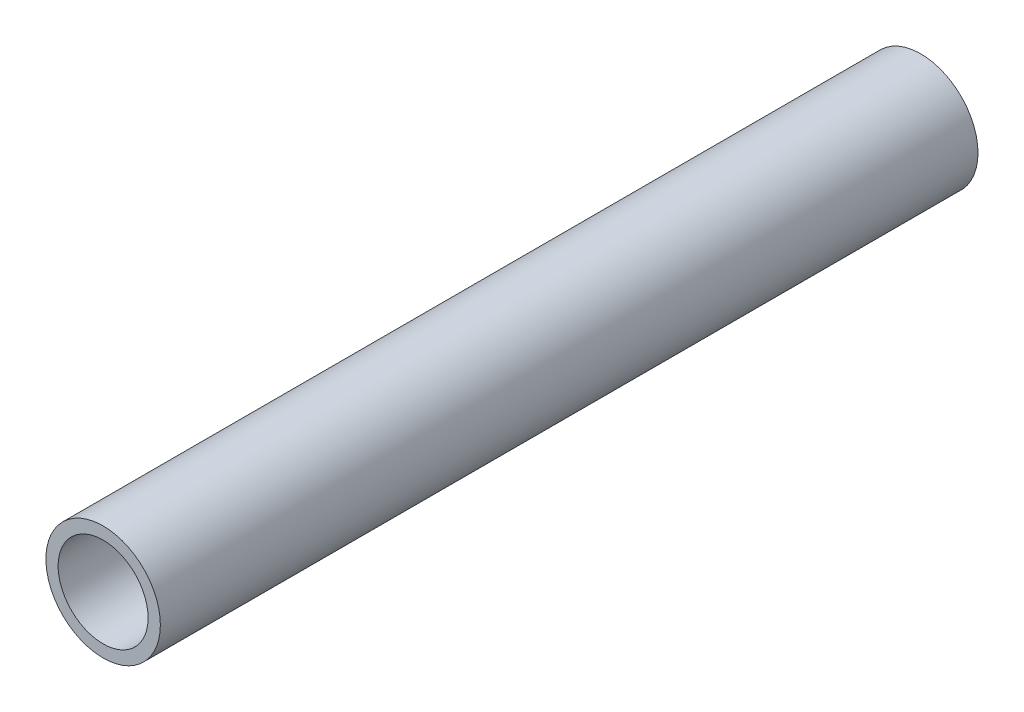
ISO-10303-21;
HEADER;
FILE_DESCRIPTION(('STEP AP214'),'2;1');
FILE_NAME('part.step','',(''),(''),'','','');
FILE_SCHEMA(('AUTOMOTIVE_DESIGN { 1 0 10303 214 1 1 1 1 }'));
ENDSEC;
DATA;
#1=APPLICATION_CONTEXT('core data for automotive mechanical design processes');
#2=APPLICATION_PROTOCOL_DEFINITION('international standard','automotive_design',2000,#1);
#3=PRODUCT_CONTEXT('',#1,'mechanical');
#4=PRODUCT('Part','Part','',(#3));
#5=PRODUCT_RELATED_PRODUCT_CATEGORY('part','',(#4));
#6=PRODUCT_DEFINITION_FORMATION('','',#4);
#7=PRODUCT_DEFINITION_CONTEXT('part definition',#1,'design');
#8=PRODUCT_DEFINITION('design','',#6,#7);
#9=PRODUCT_DEFINITION_SHAPE('','',#8);
#10=(LENGTH_UNIT() NAMED_UNIT(*) SI_UNIT(.MILLI.,.METRE.));
#11=(NAMED_UNIT(*) PLANE_ANGLE_UNIT() SI_UNIT($,.RADIAN.));
#12=(NAMED_UNIT(*) SI_UNIT($,.STERADIAN.) SOLID_ANGLE_UNIT());
#13=UNCERTAINTY_MEASURE_WITH_UNIT(LENGTH_MEASURE(1.E-05),#10,'distance_accuracy_value','');
#14=(GEOMETRIC_REPRESENTATION_CONTEXT(3) GLOBAL_UNCERTAINTY_ASSIGNED_CONTEXT((#13)) GLOBAL_UNIT_ASSIGNED_CONTEXT((#10,
#11,#12)) REPRESENTATION_CONTEXT('',''));
#15=CARTESIAN_POINT('',(0.,0.,0.));
#16=DIRECTION('',(0.,0.,1.));
#17=DIRECTION('',(1.,0.,0.));
#18=AXIS2_PLACEMENT_3D('',#15,#16,#17);
#19=CARTESIAN_POINT('',(0.,0.,50.));
#20=DIRECTION('',(0.,0.,1.));
#21=DIRECTION('',(1.,0.,0.));
#22=AXIS2_PLACEMENT_3D('',#19,#20,#21);
#23=PLANE('',#22);
#24=CARTESIAN_POINT('',(0.,0.,50.));
#25=DIRECTION('',(0.,0.,1.));
#26=DIRECTION('',(1.,0.,0.));
#27=AXIS2_PLACEMENT_3D('',#24,#25,#26);
#28=CIRCLE('',#27,3.5);
#29=CARTESIAN_POINT('',(3.5,0.,50.));
#30=VERTEX_POINT('',#29);
#31=EDGE_CURVE('E10',#30,#30,#28,.T.);
#32=ORIENTED_EDGE('',*,*,#31,.T.);
#33=EDGE_LOOP('',(#32));
#34=FACE_BOUND('',#33,.T.);
#35=CARTESIAN_POINT('',(0.,0.,50.));
#36=DIRECTION('',(0.,0.,1.));
#37=DIRECTION('',(1.,0.,0.));
#38=AXIS2_PLACEMENT_3D('',#35,#36,#37);
#39=CIRCLE('',#38,2.75);
#40=CARTESIAN_POINT('',(2.75,0.,50.));
#41=VERTEX_POINT('',#40);
#42=EDGE_CURVE('E42',#41,#41,#39,.T.);
#43=ORIENTED_EDGE('',*,*,#42,.F.);
#44=EDGE_LOOP('',(#43));
#45=FACE_BOUND('',#44,.T.);
#46=ADVANCED_FACE('F31',(#34,#45),#23,.T.);
#47=CARTESIAN_POINT('',(0.,0.,0.));
#48=DIRECTION('',(0.,0.,1.));
#49=DIRECTION('',(1.,0.,0.));
#50=AXIS2_PLACEMENT_3D('',#47,#48,#49);
#51=PLANE('',#50);
#52=CARTESIAN_POINT('',(0.,0.,0.));
#53=DIRECTION('',(0.,0.,1.));
#54=DIRECTION('',(1.,0.,0.));
#55=AXIS2_PLACEMENT_3D('',#52,#53,#54);
#56=CIRCLE('',#55,3.5);
#57=CARTESIAN_POINT('',(3.5,0.,0.));
#58=VERTEX_POINT('',#57);
#59=EDGE_CURVE('E35',#58,#58,#56,.T.);
#60=ORIENTED_EDGE('',*,*,#59,.F.);
#61=EDGE_LOOP('',(#60));
#62=FACE_BOUND('',#61,.T.);
#63=CARTESIAN_POINT('',(0.,0.,0.));
#64=DIRECTION('',(0.,0.,1.));
#65=DIRECTION('',(1.,0.,0.));
#66=AXIS2_PLACEMENT_3D('',#63,#64,#65);
#67=CIRCLE('',#66,2.75);
#68=CARTESIAN_POINT('',(2.75,0.,0.));
#69=VERTEX_POINT('',#68);
#70=EDGE_CURVE('E44',#69,#69,#67,.T.);
#71=ORIENTED_EDGE('',*,*,#70,.T.);
#72=EDGE_LOOP('',(#71));
#73=FACE_BOUND('',#72,.T.);
#74=ADVANCED_FACE('F54',(#62,#73),#51,.F.);
#75=CARTESIAN_POINT('',(0.,0.,50.));
#76=DIRECTION('',(0.,0.,-1.));
#77=DIRECTION('',(-1.,0.,0.));
#78=AXIS2_PLACEMENT_3D('',#75,#76,#77);
#79=CYLINDRICAL_SURFACE('',#78,3.5);
#80=ORIENTED_EDGE('',*,*,#31,.F.);
#81=EDGE_LOOP('',(#80));
#82=FACE_BOUND('',#81,.T.);
#83=ORIENTED_EDGE('',*,*,#59,.T.);
#84=EDGE_LOOP('',(#83));
#85=FACE_BOUND('',#84,.T.);
#86=ADVANCED_FACE('F33',(#82,#85),#79,.T.);
#87=CARTESIAN_POINT('',(0.,0.,50.));
#88=DIRECTION('',(0.,0.,-1.));
#89=DIRECTION('',(-1.,0.,0.));
#90=AXIS2_PLACEMENT_3D('',#87,#88,#89);
#91=CYLINDRICAL_SURFACE('',#90,2.75);
#92=ORIENTED_EDGE('',*,*,#42,.T.);
#93=EDGE_LOOP('',(#92));
#94=FACE_BOUND('',#93,.T.);
#95=ORIENTED_EDGE('',*,*,#70,.F.);
#96=EDGE_LOOP('',(#95));
#97=FACE_BOUND('',#96,.T.);
#98=ADVANCED_FACE('F50',(#94,#97),#91,.F.);
#99=CLOSED_SHELL('',(#46,#74,#86,#98));
#100=MANIFOLD_SOLID_BREP('B2',#99);
#101=ADVANCED_BREP_SHAPE_REPRESENTATION('',(#18,#100),#14);
#102=SHAPE_DEFINITION_REPRESENTATION(#9,#101);
ENDSEC;
END-ISO-10303-21;
